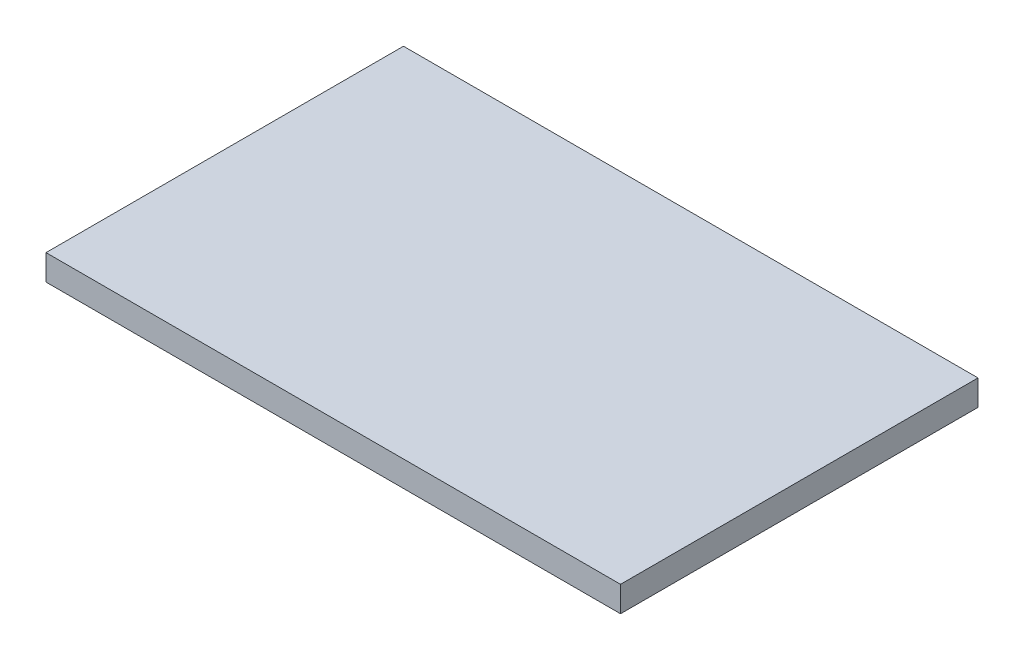
ISO-10303-21;
HEADER;
FILE_DESCRIPTION(('STEP AP214'),'2;1');
FILE_NAME('part.step','',(''),(''),'','','');
FILE_SCHEMA(('AUTOMOTIVE_DESIGN { 1 0 10303 214 1 1 1 1 }'));
ENDSEC;
DATA;
#1=APPLICATION_CONTEXT('core data for automotive mechanical design processes');
#2=APPLICATION_PROTOCOL_DEFINITION('international standard','automotive_design',2000,#1);
#3=PRODUCT_CONTEXT('',#1,'mechanical');
#4=PRODUCT('Part','Part','',(#3));
#5=PRODUCT_RELATED_PRODUCT_CATEGORY('part','',(#4));
#6=PRODUCT_DEFINITION_FORMATION('','',#4);
#7=PRODUCT_DEFINITION_CONTEXT('part definition',#1,'design');
#8=PRODUCT_DEFINITION('design','',#6,#7);
#9=PRODUCT_DEFINITION_SHAPE('','',#8);
#10=(LENGTH_UNIT() NAMED_UNIT(*) SI_UNIT(.MILLI.,.METRE.));
#11=(NAMED_UNIT(*) PLANE_ANGLE_UNIT() SI_UNIT($,.RADIAN.));
#12=(NAMED_UNIT(*) SI_UNIT($,.STERADIAN.) SOLID_ANGLE_UNIT());
#13=UNCERTAINTY_MEASURE_WITH_UNIT(LENGTH_MEASURE(1.E-05),#10,'distance_accuracy_value','');
#14=(GEOMETRIC_REPRESENTATION_CONTEXT(3) GLOBAL_UNCERTAINTY_ASSIGNED_CONTEXT((#13)) GLOBAL_UNIT_ASSIGNED_CONTEXT((#10,
#11,#12)) REPRESENTATION_CONTEXT('',''));
#15=CARTESIAN_POINT('',(0.,0.,0.));
#16=DIRECTION('',(0.,0.,1.));
#17=DIRECTION('',(1.,0.,0.));
#18=AXIS2_PLACEMENT_3D('',#15,#16,#17);
#19=CARTESIAN_POINT('',(562.5,25.,-350.));
#20=DIRECTION('',(-1.,0.,0.));
#21=DIRECTION('',(0.,0.,1.));
#22=AXIS2_PLACEMENT_3D('',#19,#20,#21);
#23=PLANE('',#22);
#24=DIRECTION('',(0.,0.,-1.));
#25=VECTOR('',#24,1.);
#26=CARTESIAN_POINT('',(562.5,-25.,-350.));
#27=LINE('',#26,#25);
#28=CARTESIAN_POINT('',(562.5,-25.,349.999999999999));
#29=VERTEX_POINT('',#28);
#30=CARTESIAN_POINT('',(562.5,-25.,-350.));
#31=VERTEX_POINT('',#30);
#32=EDGE_CURVE('E96',#29,#31,#27,.T.);
#33=ORIENTED_EDGE('',*,*,#32,.T.);
#34=DIRECTION('',(0.,-1.,0.));
#35=VECTOR('',#34,1.);
#36=CARTESIAN_POINT('',(562.5,25.,-350.));
#37=LINE('',#36,#35);
#38=CARTESIAN_POINT('',(562.5,25.,-350.));
#39=VERTEX_POINT('',#38);
#40=EDGE_CURVE('E11',#39,#31,#37,.T.);
#41=ORIENTED_EDGE('',*,*,#40,.F.);
#42=DIRECTION('',(0.,0.,-1.));
#43=VECTOR('',#42,1.);
#44=CARTESIAN_POINT('',(562.5,25.,-350.));
#45=LINE('',#44,#43);
#46=CARTESIAN_POINT('',(562.5,25.,349.999999999999));
#47=VERTEX_POINT('',#46);
#48=EDGE_CURVE('E84',#47,#39,#45,.T.);
#49=ORIENTED_EDGE('',*,*,#48,.F.);
#50=DIRECTION('',(0.,-1.,0.));
#51=VECTOR('',#50,1.);
#52=CARTESIAN_POINT('',(562.5,25.,349.999999999999));
#53=LINE('',#52,#51);
#54=EDGE_CURVE('E92',#47,#29,#53,.T.);
#55=ORIENTED_EDGE('',*,*,#54,.T.);
#56=EDGE_LOOP('',(#33,#41,#49,#55));
#57=FACE_BOUND('',#56,.T.);
#58=ADVANCED_FACE('F33',(#57),#23,.F.);
#59=CARTESIAN_POINT('',(-562.5,25.,-350.));
#60=DIRECTION('',(0.,0.,1.));
#61=DIRECTION('',(1.,0.,0.));
#62=AXIS2_PLACEMENT_3D('',#59,#60,#61);
#63=PLANE('',#62);
#64=DIRECTION('',(-1.,0.,0.));
#65=VECTOR('',#64,1.);
#66=CARTESIAN_POINT('',(-562.5,-25.,-350.));
#67=LINE('',#66,#65);
#68=CARTESIAN_POINT('',(-562.5,-25.,-350.));
#69=VERTEX_POINT('',#68);
#70=EDGE_CURVE('E88',#31,#69,#67,.T.);
#71=ORIENTED_EDGE('',*,*,#70,.T.);
#72=DIRECTION('',(0.,-1.,0.));
#73=VECTOR('',#72,1.);
#74=CARTESIAN_POINT('',(-562.5,25.,-350.));
#75=LINE('',#74,#73);
#76=CARTESIAN_POINT('',(-562.5,25.,-350.));
#77=VERTEX_POINT('',#76);
#78=EDGE_CURVE('E41',#77,#69,#75,.T.);
#79=ORIENTED_EDGE('',*,*,#78,.F.);
#80=DIRECTION('',(-1.,0.,0.));
#81=VECTOR('',#80,1.);
#82=CARTESIAN_POINT('',(-562.5,25.,-350.));
#83=LINE('',#82,#81);
#84=EDGE_CURVE('E79',#39,#77,#83,.T.);
#85=ORIENTED_EDGE('',*,*,#84,.F.);
#86=ORIENTED_EDGE('',*,*,#40,.T.);
#87=EDGE_LOOP('',(#71,#79,#85,#86));
#88=FACE_BOUND('',#87,.T.);
#89=ADVANCED_FACE('F87',(#88),#63,.F.);
#90=CARTESIAN_POINT('',(-562.5,25.,-350.));
#91=DIRECTION('',(1.,0.,0.));
#92=DIRECTION('',(0.,0.,-1.));
#93=AXIS2_PLACEMENT_3D('',#90,#91,#92);
#94=PLANE('',#93);
#95=DIRECTION('',(0.,0.,1.));
#96=VECTOR('',#95,1.);
#97=CARTESIAN_POINT('',(-562.5,-25.,-350.));
#98=LINE('',#97,#96);
#99=CARTESIAN_POINT('',(-562.5,-25.,350.));
#100=VERTEX_POINT('',#99);
#101=EDGE_CURVE('E66',#69,#100,#98,.T.);
#102=ORIENTED_EDGE('',*,*,#101,.T.);
#103=DIRECTION('',(0.,-1.,0.));
#104=VECTOR('',#103,1.);
#105=CARTESIAN_POINT('',(-562.5,25.,350.));
#106=LINE('',#105,#104);
#107=CARTESIAN_POINT('',(-562.5,25.,350.));
#108=VERTEX_POINT('',#107);
#109=EDGE_CURVE('E89',#108,#100,#106,.T.);
#110=ORIENTED_EDGE('',*,*,#109,.F.);
#111=DIRECTION('',(0.,0.,1.));
#112=VECTOR('',#111,1.);
#113=CARTESIAN_POINT('',(-562.5,25.,-350.));
#114=LINE('',#113,#112);
#115=EDGE_CURVE('E82',#77,#108,#114,.T.);
#116=ORIENTED_EDGE('',*,*,#115,.F.);
#117=ORIENTED_EDGE('',*,*,#78,.T.);
#118=EDGE_LOOP('',(#102,#110,#116,#117));
#119=FACE_BOUND('',#118,.T.);
#120=ADVANCED_FACE('F90',(#119),#94,.F.);
#121=CARTESIAN_POINT('',(-562.5,25.,350.));
#122=DIRECTION('',(0.,0.,-1.));
#123=DIRECTION('',(-1.,0.,0.));
#124=AXIS2_PLACEMENT_3D('',#121,#122,#123);
#125=PLANE('',#124);
#126=DIRECTION('',(1.,0.,0.));
#127=VECTOR('',#126,1.);
#128=CARTESIAN_POINT('',(-562.5,-25.,350.));
#129=LINE('',#128,#127);
#130=EDGE_CURVE('E72',#100,#29,#129,.T.);
#131=ORIENTED_EDGE('',*,*,#130,.T.);
#132=ORIENTED_EDGE('',*,*,#54,.F.);
#133=DIRECTION('',(1.,0.,0.));
#134=VECTOR('',#133,1.);
#135=CARTESIAN_POINT('',(-562.5,25.,350.));
#136=LINE('',#135,#134);
#137=EDGE_CURVE('E49',#108,#47,#136,.T.);
#138=ORIENTED_EDGE('',*,*,#137,.F.);
#139=ORIENTED_EDGE('',*,*,#109,.T.);
#140=EDGE_LOOP('',(#131,#132,#138,#139));
#141=FACE_BOUND('',#140,.T.);
#142=ADVANCED_FACE('F103',(#141),#125,.F.);
#143=CARTESIAN_POINT('',(0.,25.,0.));
#144=DIRECTION('',(0.,1.,0.));
#145=DIRECTION('',(0.,0.,1.));
#146=AXIS2_PLACEMENT_3D('',#143,#144,#145);
#147=PLANE('',#146);
#148=ORIENTED_EDGE('',*,*,#48,.T.);
#149=ORIENTED_EDGE('',*,*,#84,.T.);
#150=ORIENTED_EDGE('',*,*,#115,.T.);
#151=ORIENTED_EDGE('',*,*,#137,.T.);
#152=EDGE_LOOP('',(#148,#149,#150,#151));
#153=FACE_BOUND('',#152,.T.);
#154=ADVANCED_FACE('F80',(#153),#147,.T.);
#155=CARTESIAN_POINT('',(0.,-25.,0.));
#156=DIRECTION('',(0.,1.,0.));
#157=DIRECTION('',(0.,0.,1.));
#158=AXIS2_PLACEMENT_3D('',#155,#156,#157);
#159=PLANE('',#158);
#160=ORIENTED_EDGE('',*,*,#32,.F.);
#161=ORIENTED_EDGE('',*,*,#130,.F.);
#162=ORIENTED_EDGE('',*,*,#101,.F.);
#163=ORIENTED_EDGE('',*,*,#70,.F.);
#164=EDGE_LOOP('',(#160,#161,#162,#163));
#165=FACE_BOUND('',#164,.T.);
#166=ADVANCED_FACE('F106',(#165),#159,.F.);
#167=CLOSED_SHELL('',(#58,#89,#120,#142,#154,#166));
#168=MANIFOLD_SOLID_BREP('B2',#167);
#169=ADVANCED_BREP_SHAPE_REPRESENTATION('',(#18,#168),#14);
#170=SHAPE_DEFINITION_REPRESENTATION(#9,#169);
ENDSEC;
END-ISO-10303-21;
